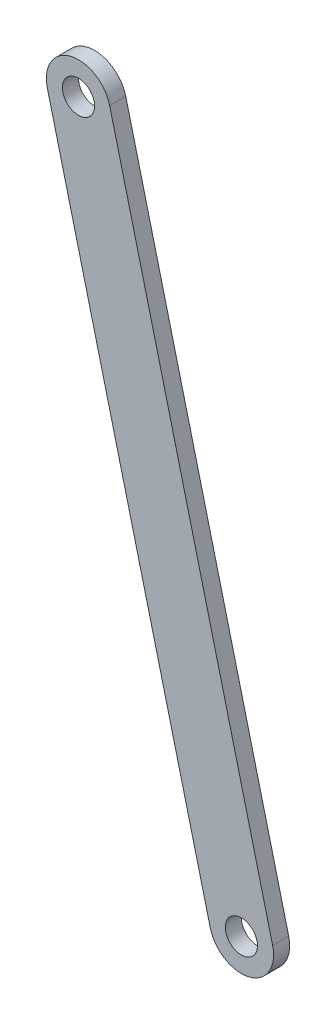
ISO-10303-21;
HEADER;
FILE_DESCRIPTION(('STEP AP214'),'2;1');
FILE_NAME('part.step','',(''),(''),'','','');
FILE_SCHEMA(('AUTOMOTIVE_DESIGN { 1 0 10303 214 1 1 1 1 }'));
ENDSEC;
DATA;
#1=APPLICATION_CONTEXT('core data for automotive mechanical design processes');
#2=APPLICATION_PROTOCOL_DEFINITION('international standard','automotive_design',2000,#1);
#3=PRODUCT_CONTEXT('',#1,'mechanical');
#4=PRODUCT('Part','Part','',(#3));
#5=PRODUCT_RELATED_PRODUCT_CATEGORY('part','',(#4));
#6=PRODUCT_DEFINITION_FORMATION('','',#4);
#7=PRODUCT_DEFINITION_CONTEXT('part definition',#1,'design');
#8=PRODUCT_DEFINITION('design','',#6,#7);
#9=PRODUCT_DEFINITION_SHAPE('','',#8);
#10=(LENGTH_UNIT() NAMED_UNIT(*) SI_UNIT(.MILLI.,.METRE.));
#11=(NAMED_UNIT(*) PLANE_ANGLE_UNIT() SI_UNIT($,.RADIAN.));
#12=(NAMED_UNIT(*) SI_UNIT($,.STERADIAN.) SOLID_ANGLE_UNIT());
#13=UNCERTAINTY_MEASURE_WITH_UNIT(LENGTH_MEASURE(1.E-05),#10,'distance_accuracy_value','');
#14=(GEOMETRIC_REPRESENTATION_CONTEXT(3) GLOBAL_UNCERTAINTY_ASSIGNED_CONTEXT((#13)) GLOBAL_UNIT_ASSIGNED_CONTEXT((#10,
#11,#12)) REPRESENTATION_CONTEXT('',''));
#15=CARTESIAN_POINT('',(0.,0.,0.));
#16=DIRECTION('',(0.,0.,1.));
#17=DIRECTION('',(1.,0.,0.));
#18=AXIS2_PLACEMENT_3D('',#15,#16,#17);
#19=CARTESIAN_POINT('',(-59.231514961415,-28.0529302307478,3.175));
#20=DIRECTION('',(0.,0.,1.));
#21=DIRECTION('',(1.,0.,0.));
#22=AXIS2_PLACEMENT_3D('',#19,#20,#21);
#23=PLANE('',#22);
#24=CARTESIAN_POINT('',(-43.1601105241046,-91.7569329261232,3.175));
#25=DIRECTION('',(0.,0.,1.));
#26=DIRECTION('',(1.,0.,0.));
#27=AXIS2_PLACEMENT_3D('',#24,#25,#26);
#28=CIRCLE('',#27,1.5875);
#29=CARTESIAN_POINT('',(-41.5726105241046,-91.7569329261232,3.175));
#30=VERTEX_POINT('',#29);
#31=EDGE_CURVE('E101',#30,#30,#28,.T.);
#32=ORIENTED_EDGE('',*,*,#31,.F.);
#33=EDGE_LOOP('',(#32));
#34=FACE_BOUND('',#33,.T.);
#35=CARTESIAN_POINT('',(-59.231514961415,-28.0529302307478,3.175));
#36=DIRECTION('',(0.,0.,1.));
#37=DIRECTION('',(1.,0.,0.));
#38=AXIS2_PLACEMENT_3D('',#35,#36,#37);
#39=CIRCLE('',#38,3.17500000000001);
#40=CARTESIAN_POINT('',(-56.1529729742336,-27.2762679919584,3.175));
#41=VERTEX_POINT('',#40);
#42=CARTESIAN_POINT('',(-62.3100569485964,-28.8295924695371,3.175));
#43=VERTEX_POINT('',#42);
#44=EDGE_CURVE('E86',#41,#43,#39,.T.);
#45=ORIENTED_EDGE('',*,*,#44,.T.);
#46=DIRECTION('',(0.24461802796515,-0.969619523521696,0.));
#47=VECTOR('',#46,1.);
#48=CARTESIAN_POINT('',(-62.3100569485964,-28.8295924695371,3.175));
#49=LINE('',#48,#47);
#50=CARTESIAN_POINT('',(-46.238652511286,-92.5335951649126,3.175));
#51=VERTEX_POINT('',#50);
#52=EDGE_CURVE('E81',#43,#51,#49,.T.);
#53=ORIENTED_EDGE('',*,*,#52,.T.);
#54=CARTESIAN_POINT('',(-43.1601105241046,-91.7569329261232,3.175));
#55=DIRECTION('',(0.,0.,1.));
#56=DIRECTION('',(1.,0.,0.));
#57=AXIS2_PLACEMENT_3D('',#54,#55,#56);
#58=CIRCLE('',#57,3.175);
#59=CARTESIAN_POINT('',(-40.0815685369232,-90.9802706873339,3.175));
#60=VERTEX_POINT('',#59);
#61=EDGE_CURVE('E84',#51,#60,#58,.T.);
#62=ORIENTED_EDGE('',*,*,#61,.T.);
#63=DIRECTION('',(-0.24461802796515,0.969619523521696,0.));
#64=VECTOR('',#63,1.);
#65=CARTESIAN_POINT('',(-56.1529729742336,-27.2762679919584,3.175));
#66=LINE('',#65,#64);
#67=EDGE_CURVE('E51',#60,#41,#66,.T.);
#68=ORIENTED_EDGE('',*,*,#67,.T.);
#69=EDGE_LOOP('',(#45,#53,#62,#68));
#70=FACE_BOUND('',#69,.T.);
#71=CARTESIAN_POINT('',(-59.231514961415,-28.0529302307478,3.175));
#72=DIRECTION('',(0.,0.,1.));
#73=DIRECTION('',(1.,0.,0.));
#74=AXIS2_PLACEMENT_3D('',#71,#72,#73);
#75=CIRCLE('',#74,1.5875);
#76=CARTESIAN_POINT('',(-57.644014961415,-28.0529302307478,3.175));
#77=VERTEX_POINT('',#76);
#78=EDGE_CURVE('E116',#77,#77,#75,.T.);
#79=ORIENTED_EDGE('',*,*,#78,.F.);
#80=EDGE_LOOP('',(#79));
#81=FACE_BOUND('',#80,.T.);
#82=ADVANCED_FACE('F34',(#34,#70,#81),#23,.T.);
#83=CARTESIAN_POINT('',(-59.231514961415,-28.0529302307478,1.5875));
#84=DIRECTION('',(0.,0.,1.));
#85=DIRECTION('',(1.,0.,0.));
#86=AXIS2_PLACEMENT_3D('',#83,#84,#85);
#87=PLANE('',#86);
#88=CARTESIAN_POINT('',(-43.1601105241046,-91.7569329261232,1.5875));
#89=DIRECTION('',(0.,0.,1.));
#90=DIRECTION('',(1.,0.,0.));
#91=AXIS2_PLACEMENT_3D('',#88,#89,#90);
#92=CIRCLE('',#91,1.5875);
#93=CARTESIAN_POINT('',(-41.5726105241046,-91.7569329261232,1.5875));
#94=VERTEX_POINT('',#93);
#95=EDGE_CURVE('E113',#94,#94,#92,.T.);
#96=ORIENTED_EDGE('',*,*,#95,.T.);
#97=EDGE_LOOP('',(#96));
#98=FACE_BOUND('',#97,.T.);
#99=CARTESIAN_POINT('',(-59.231514961415,-28.0529302307478,1.5875));
#100=DIRECTION('',(0.,0.,1.));
#101=DIRECTION('',(1.,0.,0.));
#102=AXIS2_PLACEMENT_3D('',#99,#100,#101);
#103=CIRCLE('',#102,3.17500000000001);
#104=CARTESIAN_POINT('',(-56.1529729742336,-27.2762679919584,1.5875));
#105=VERTEX_POINT('',#104);
#106=CARTESIAN_POINT('',(-62.3100569485964,-28.8295924695371,1.5875));
#107=VERTEX_POINT('',#106);
#108=EDGE_CURVE('E98',#105,#107,#103,.T.);
#109=ORIENTED_EDGE('',*,*,#108,.F.);
#110=DIRECTION('',(-0.24461802796515,0.969619523521696,0.));
#111=VECTOR('',#110,1.);
#112=CARTESIAN_POINT('',(-56.1529729742336,-27.2762679919584,1.5875));
#113=LINE('',#112,#111);
#114=CARTESIAN_POINT('',(-40.0815685369232,-90.9802706873339,1.5875));
#115=VERTEX_POINT('',#114);
#116=EDGE_CURVE('E74',#115,#105,#113,.T.);
#117=ORIENTED_EDGE('',*,*,#116,.F.);
#118=CARTESIAN_POINT('',(-43.1601105241046,-91.7569329261232,1.5875));
#119=DIRECTION('',(0.,0.,1.));
#120=DIRECTION('',(1.,0.,0.));
#121=AXIS2_PLACEMENT_3D('',#118,#119,#120);
#122=CIRCLE('',#121,3.175);
#123=CARTESIAN_POINT('',(-46.238652511286,-92.5335951649126,1.5875));
#124=VERTEX_POINT('',#123);
#125=EDGE_CURVE('E68',#124,#115,#122,.T.);
#126=ORIENTED_EDGE('',*,*,#125,.F.);
#127=DIRECTION('',(0.24461802796515,-0.969619523521696,0.));
#128=VECTOR('',#127,1.);
#129=CARTESIAN_POINT('',(-62.3100569485964,-28.8295924695371,1.5875));
#130=LINE('',#129,#128);
#131=EDGE_CURVE('E90',#107,#124,#130,.T.);
#132=ORIENTED_EDGE('',*,*,#131,.F.);
#133=EDGE_LOOP('',(#109,#117,#126,#132));
#134=FACE_BOUND('',#133,.T.);
#135=CARTESIAN_POINT('',(-59.231514961415,-28.0529302307478,1.5875));
#136=DIRECTION('',(0.,0.,1.));
#137=DIRECTION('',(1.,0.,0.));
#138=AXIS2_PLACEMENT_3D('',#135,#136,#137);
#139=CIRCLE('',#138,1.5875);
#140=CARTESIAN_POINT('',(-57.644014961415,-28.0529302307478,1.5875));
#141=VERTEX_POINT('',#140);
#142=EDGE_CURVE('E119',#141,#141,#139,.T.);
#143=ORIENTED_EDGE('',*,*,#142,.T.);
#144=EDGE_LOOP('',(#143));
#145=FACE_BOUND('',#144,.T.);
#146=ADVANCED_FACE('F109',(#98,#134,#145),#87,.F.);
#147=CARTESIAN_POINT('',(-59.231514961415,-28.0529302307478,3.175));
#148=DIRECTION('',(0.,0.,-1.));
#149=DIRECTION('',(-1.,0.,0.));
#150=AXIS2_PLACEMENT_3D('',#147,#148,#149);
#151=CYLINDRICAL_SURFACE('',#150,3.17500000000001);
#152=ORIENTED_EDGE('',*,*,#108,.T.);
#153=DIRECTION('',(0.,0.,-1.));
#154=VECTOR('',#153,1.);
#155=CARTESIAN_POINT('',(-62.3100569485964,-28.8295924695371,3.175));
#156=LINE('',#155,#154);
#157=EDGE_CURVE('E11',#43,#107,#156,.T.);
#158=ORIENTED_EDGE('',*,*,#157,.F.);
#159=ORIENTED_EDGE('',*,*,#44,.F.);
#160=DIRECTION('',(0.,0.,-1.));
#161=VECTOR('',#160,1.);
#162=CARTESIAN_POINT('',(-56.1529729742336,-27.2762679919584,3.175));
#163=LINE('',#162,#161);
#164=EDGE_CURVE('E94',#41,#105,#163,.T.);
#165=ORIENTED_EDGE('',*,*,#164,.T.);
#166=EDGE_LOOP('',(#152,#158,#159,#165));
#167=FACE_BOUND('',#166,.T.);
#168=ADVANCED_FACE('F36',(#167),#151,.T.);
#169=CARTESIAN_POINT('',(-62.3100569485964,-28.8295924695371,3.175));
#170=DIRECTION('',(0.969619523521696,0.24461802796515,0.));
#171=DIRECTION('',(-0.24461802796515,0.969619523521696,0.));
#172=AXIS2_PLACEMENT_3D('',#169,#170,#171);
#173=PLANE('',#172);
#174=ORIENTED_EDGE('',*,*,#131,.T.);
#175=DIRECTION('',(0.,0.,-1.));
#176=VECTOR('',#175,1.);
#177=CARTESIAN_POINT('',(-46.238652511286,-92.5335951649126,3.175));
#178=LINE('',#177,#176);
#179=EDGE_CURVE('E43',#51,#124,#178,.T.);
#180=ORIENTED_EDGE('',*,*,#179,.F.);
#181=ORIENTED_EDGE('',*,*,#52,.F.);
#182=ORIENTED_EDGE('',*,*,#157,.T.);
#183=EDGE_LOOP('',(#174,#180,#181,#182));
#184=FACE_BOUND('',#183,.T.);
#185=ADVANCED_FACE('F89',(#184),#173,.F.);
#186=CARTESIAN_POINT('',(-43.1601105241046,-91.7569329261232,3.175));
#187=DIRECTION('',(0.,0.,-1.));
#188=DIRECTION('',(-1.,0.,0.));
#189=AXIS2_PLACEMENT_3D('',#186,#187,#188);
#190=CYLINDRICAL_SURFACE('',#189,3.175);
#191=ORIENTED_EDGE('',*,*,#125,.T.);
#192=DIRECTION('',(0.,0.,-1.));
#193=VECTOR('',#192,1.);
#194=CARTESIAN_POINT('',(-40.0815685369232,-90.9802706873339,3.175));
#195=LINE('',#194,#193);
#196=EDGE_CURVE('E91',#60,#115,#195,.T.);
#197=ORIENTED_EDGE('',*,*,#196,.F.);
#198=ORIENTED_EDGE('',*,*,#61,.F.);
#199=ORIENTED_EDGE('',*,*,#179,.T.);
#200=EDGE_LOOP('',(#191,#197,#198,#199));
#201=FACE_BOUND('',#200,.T.);
#202=ADVANCED_FACE('F92',(#201),#190,.T.);
#203=CARTESIAN_POINT('',(-56.1529729742336,-27.2762679919584,3.175));
#204=DIRECTION('',(-0.969619523521696,-0.24461802796515,0.));
#205=DIRECTION('',(0.24461802796515,-0.969619523521696,0.));
#206=AXIS2_PLACEMENT_3D('',#203,#204,#205);
#207=PLANE('',#206);
#208=ORIENTED_EDGE('',*,*,#116,.T.);
#209=ORIENTED_EDGE('',*,*,#164,.F.);
#210=ORIENTED_EDGE('',*,*,#67,.F.);
#211=ORIENTED_EDGE('',*,*,#196,.T.);
#212=EDGE_LOOP('',(#208,#209,#210,#211));
#213=FACE_BOUND('',#212,.T.);
#214=ADVANCED_FACE('F106',(#213),#207,.F.);
#215=CARTESIAN_POINT('',(-43.1601105241046,-91.7569329261232,3.175));
#216=DIRECTION('',(0.,0.,-1.));
#217=DIRECTION('',(-1.,0.,0.));
#218=AXIS2_PLACEMENT_3D('',#215,#216,#217);
#219=CYLINDRICAL_SURFACE('',#218,1.5875);
#220=ORIENTED_EDGE('',*,*,#31,.T.);
#221=EDGE_LOOP('',(#220));
#222=FACE_BOUND('',#221,.T.);
#223=ORIENTED_EDGE('',*,*,#95,.F.);
#224=EDGE_LOOP('',(#223));
#225=FACE_BOUND('',#224,.T.);
#226=ADVANCED_FACE('F137',(#222,#225),#219,.F.);
#227=CARTESIAN_POINT('',(-59.231514961415,-28.0529302307478,3.175));
#228=DIRECTION('',(0.,0.,-1.));
#229=DIRECTION('',(-1.,0.,0.));
#230=AXIS2_PLACEMENT_3D('',#227,#228,#229);
#231=CYLINDRICAL_SURFACE('',#230,1.5875);
#232=ORIENTED_EDGE('',*,*,#78,.T.);
#233=EDGE_LOOP('',(#232));
#234=FACE_BOUND('',#233,.T.);
#235=ORIENTED_EDGE('',*,*,#142,.F.);
#236=EDGE_LOOP('',(#235));
#237=FACE_BOUND('',#236,.T.);
#238=ADVANCED_FACE('F125',(#234,#237),#231,.F.);
#239=CLOSED_SHELL('',(#82,#146,#168,#185,#202,#214,#226,#238));
#240=MANIFOLD_SOLID_BREP('B2',#239);
#241=ADVANCED_BREP_SHAPE_REPRESENTATION('',(#18,#240),#14);
#242=SHAPE_DEFINITION_REPRESENTATION(#9,#241);
ENDSEC;
END-ISO-10303-21;
